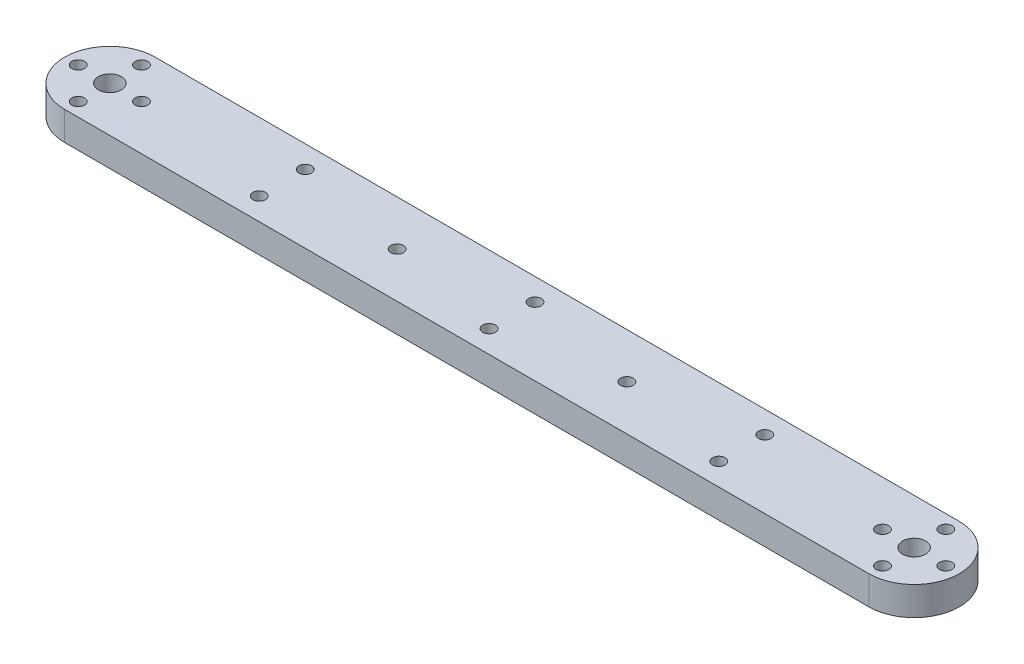
ISO-10303-21;
HEADER;
FILE_DESCRIPTION(('STEP AP214'),'2;1');
FILE_NAME('part.step','',(''),(''),'','','');
FILE_SCHEMA(('AUTOMOTIVE_DESIGN { 1 0 10303 214 1 1 1 1 }'));
ENDSEC;
DATA;
#1=APPLICATION_CONTEXT('core data for automotive mechanical design processes');
#2=APPLICATION_PROTOCOL_DEFINITION('international standard','automotive_design',2000,#1);
#3=PRODUCT_CONTEXT('',#1,'mechanical');
#4=PRODUCT('Part','Part','',(#3));
#5=PRODUCT_RELATED_PRODUCT_CATEGORY('part','',(#4));
#6=PRODUCT_DEFINITION_FORMATION('','',#4);
#7=PRODUCT_DEFINITION_CONTEXT('part definition',#1,'design');
#8=PRODUCT_DEFINITION('design','',#6,#7);
#9=PRODUCT_DEFINITION_SHAPE('','',#8);
#10=(LENGTH_UNIT() NAMED_UNIT(*) SI_UNIT(.MILLI.,.METRE.));
#11=(NAMED_UNIT(*) PLANE_ANGLE_UNIT() SI_UNIT($,.RADIAN.));
#12=(NAMED_UNIT(*) SI_UNIT($,.STERADIAN.) SOLID_ANGLE_UNIT());
#13=UNCERTAINTY_MEASURE_WITH_UNIT(LENGTH_MEASURE(1.E-05),#10,'distance_accuracy_value','');
#14=(GEOMETRIC_REPRESENTATION_CONTEXT(3) GLOBAL_UNCERTAINTY_ASSIGNED_CONTEXT((#13)) GLOBAL_UNIT_ASSIGNED_CONTEXT((#10,
#11,#12)) REPRESENTATION_CONTEXT('',''));
#15=CARTESIAN_POINT('',(0.,0.,0.));
#16=DIRECTION('',(0.,0.,1.));
#17=DIRECTION('',(1.,0.,0.));
#18=AXIS2_PLACEMENT_3D('',#15,#16,#17);
#19=CARTESIAN_POINT('',(0.,6.35,0.));
#20=DIRECTION('',(0.,1.,0.));
#21=DIRECTION('',(0.,0.,1.));
#22=AXIS2_PLACEMENT_3D('',#19,#20,#21);
#23=PLANE('',#22);
#24=CARTESIAN_POINT('',(139.7,6.35,-5.08000000000001));
#25=DIRECTION('',(0.,1.,0.));
#26=DIRECTION('',(0.,0.,1.));
#27=AXIS2_PLACEMENT_3D('',#24,#25,#26);
#28=CIRCLE('',#27,1.39699999999999);
#29=CARTESIAN_POINT('',(139.7,6.35,-3.68300000000002));
#30=VERTEX_POINT('',#29);
#31=EDGE_CURVE('E214',#30,#30,#28,.T.);
#32=ORIENTED_EDGE('',*,*,#31,.F.);
#33=EDGE_LOOP('',(#32));
#34=FACE_BOUND('',#33,.T.);
#35=CARTESIAN_POINT('',(38.1,6.35,5.08000000000001));
#36=DIRECTION('',(0.,1.,0.));
#37=DIRECTION('',(0.,0.,1.));
#38=AXIS2_PLACEMENT_3D('',#35,#36,#37);
#39=CIRCLE('',#38,1.39699999999999);
#40=CARTESIAN_POINT('',(38.1,6.35,6.477));
#41=VERTEX_POINT('',#40);
#42=EDGE_CURVE('E201',#41,#41,#39,.T.);
#43=ORIENTED_EDGE('',*,*,#42,.F.);
#44=EDGE_LOOP('',(#43));
#45=FACE_BOUND('',#44,.T.);
#46=CARTESIAN_POINT('',(63.5,6.35,0.));
#47=DIRECTION('',(0.,1.,0.));
#48=DIRECTION('',(0.,0.,1.));
#49=AXIS2_PLACEMENT_3D('',#46,#47,#48);
#50=CIRCLE('',#49,1.39699999999999);
#51=CARTESIAN_POINT('',(63.5,6.35,1.39699999999999));
#52=VERTEX_POINT('',#51);
#53=EDGE_CURVE('E191',#52,#52,#50,.T.);
#54=ORIENTED_EDGE('',*,*,#53,.F.);
#55=EDGE_LOOP('',(#54));
#56=FACE_BOUND('',#55,.T.);
#57=CARTESIAN_POINT('',(88.9,6.35,-5.08));
#58=DIRECTION('',(0.,1.,0.));
#59=DIRECTION('',(0.,0.,1.));
#60=AXIS2_PLACEMENT_3D('',#57,#58,#59);
#61=CIRCLE('',#60,1.39699999999999);
#62=CARTESIAN_POINT('',(88.9,6.35,-3.68300000000001));
#63=VERTEX_POINT('',#62);
#64=EDGE_CURVE('E178',#63,#63,#61,.T.);
#65=ORIENTED_EDGE('',*,*,#64,.F.);
#66=EDGE_LOOP('',(#65));
#67=FACE_BOUND('',#66,.T.);
#68=CARTESIAN_POINT('',(177.8,6.35,0.));
#69=DIRECTION('',(0.,1.,0.));
#70=DIRECTION('',(0.,0.,-1.));
#71=AXIS2_PLACEMENT_3D('',#68,#69,#70);
#72=CIRCLE('',#71,2.53999999999998);
#73=CARTESIAN_POINT('',(177.8,6.35,-2.53999999999998));
#74=VERTEX_POINT('',#73);
#75=EDGE_CURVE('E170',#74,#74,#72,.T.);
#76=ORIENTED_EDGE('',*,*,#75,.F.);
#77=EDGE_LOOP('',(#76));
#78=FACE_BOUND('',#77,.T.);
#79=CARTESIAN_POINT('',(184.8,6.35,0.));
#80=DIRECTION('',(0.,1.,0.));
#81=DIRECTION('',(0.,0.,-1.));
#82=AXIS2_PLACEMENT_3D('',#79,#80,#81);
#83=CIRCLE('',#82,1.39699999999997);
#84=CARTESIAN_POINT('',(184.8,6.35,-1.39699999999997));
#85=VERTEX_POINT('',#84);
#86=EDGE_CURVE('E154',#85,#85,#83,.T.);
#87=ORIENTED_EDGE('',*,*,#86,.F.);
#88=EDGE_LOOP('',(#87));
#89=FACE_BOUND('',#88,.T.);
#90=CARTESIAN_POINT('',(0.,6.35,7.));
#91=DIRECTION('',(0.,1.,0.));
#92=DIRECTION('',(0.,0.,1.));
#93=AXIS2_PLACEMENT_3D('',#90,#91,#92);
#94=CIRCLE('',#93,1.397);
#95=CARTESIAN_POINT('',(0.,6.35,8.397));
#96=VERTEX_POINT('',#95);
#97=EDGE_CURVE('E141',#96,#96,#94,.T.);
#98=ORIENTED_EDGE('',*,*,#97,.F.);
#99=EDGE_LOOP('',(#98));
#100=FACE_BOUND('',#99,.T.);
#101=CARTESIAN_POINT('',(0.,6.35,-7.));
#102=DIRECTION('',(0.,1.,0.));
#103=DIRECTION('',(0.,0.,1.));
#104=AXIS2_PLACEMENT_3D('',#101,#102,#103);
#105=CIRCLE('',#104,1.397);
#106=CARTESIAN_POINT('',(0.,6.35,-5.603));
#107=VERTEX_POINT('',#106);
#108=EDGE_CURVE('E132',#107,#107,#105,.T.);
#109=ORIENTED_EDGE('',*,*,#108,.F.);
#110=EDGE_LOOP('',(#109));
#111=FACE_BOUND('',#110,.T.);
#112=CARTESIAN_POINT('',(-7.,6.35,0.));
#113=DIRECTION('',(0.,1.,0.));
#114=DIRECTION('',(0.,0.,1.));
#115=AXIS2_PLACEMENT_3D('',#112,#113,#114);
#116=CIRCLE('',#115,1.397);
#117=CARTESIAN_POINT('',(-7.,6.35,1.397));
#118=VERTEX_POINT('',#117);
#119=EDGE_CURVE('E109',#118,#118,#116,.T.);
#120=ORIENTED_EDGE('',*,*,#119,.F.);
#121=EDGE_LOOP('',(#120));
#122=FACE_BOUND('',#121,.T.);
#123=CARTESIAN_POINT('',(0.,6.35,0.));
#124=DIRECTION('',(0.,1.,0.));
#125=DIRECTION('',(0.,0.,1.));
#126=AXIS2_PLACEMENT_3D('',#123,#124,#125);
#127=CIRCLE('',#126,10.);
#128=CARTESIAN_POINT('',(0.,6.35,-10.));
#129=VERTEX_POINT('',#128);
#130=CARTESIAN_POINT('',(0.,6.35,10.));
#131=VERTEX_POINT('',#130);
#132=EDGE_CURVE('E92',#129,#131,#127,.T.);
#133=ORIENTED_EDGE('',*,*,#132,.T.);
#134=DIRECTION('',(1.,0.,0.));
#135=VECTOR('',#134,1.);
#136=CARTESIAN_POINT('',(0.,6.35,10.));
#137=LINE('',#136,#135);
#138=CARTESIAN_POINT('',(177.8,6.35,10.));
#139=VERTEX_POINT('',#138);
#140=EDGE_CURVE('E89',#131,#139,#137,.T.);
#141=ORIENTED_EDGE('',*,*,#140,.T.);
#142=CARTESIAN_POINT('',(177.8,6.35,0.));
#143=DIRECTION('',(0.,1.,0.));
#144=DIRECTION('',(0.,0.,1.));
#145=AXIS2_PLACEMENT_3D('',#142,#143,#144);
#146=CIRCLE('',#145,10.);
#147=CARTESIAN_POINT('',(177.8,6.35,-10.));
#148=VERTEX_POINT('',#147);
#149=EDGE_CURVE('E91',#139,#148,#146,.T.);
#150=ORIENTED_EDGE('',*,*,#149,.T.);
#151=DIRECTION('',(-1.,0.,0.));
#152=VECTOR('',#151,1.);
#153=CARTESIAN_POINT('',(0.,6.35,-10.));
#154=LINE('',#153,#152);
#155=EDGE_CURVE('E58',#148,#129,#154,.T.);
#156=ORIENTED_EDGE('',*,*,#155,.T.);
#157=EDGE_LOOP('',(#133,#141,#150,#156));
#158=FACE_BOUND('',#157,.T.);
#159=CARTESIAN_POINT('',(0.,6.35,0.));
#160=DIRECTION('',(0.,1.,0.));
#161=DIRECTION('',(0.,0.,1.));
#162=AXIS2_PLACEMENT_3D('',#159,#160,#161);
#163=CIRCLE('',#162,2.54);
#164=CARTESIAN_POINT('',(0.,6.35,2.54));
#165=VERTEX_POINT('',#164);
#166=EDGE_CURVE('E125',#165,#165,#163,.T.);
#167=ORIENTED_EDGE('',*,*,#166,.F.);
#168=EDGE_LOOP('',(#167));
#169=FACE_BOUND('',#168,.T.);
#170=CARTESIAN_POINT('',(7.,6.35,0.));
#171=DIRECTION('',(0.,1.,0.));
#172=DIRECTION('',(0.,0.,1.));
#173=AXIS2_PLACEMENT_3D('',#170,#171,#172);
#174=CIRCLE('',#173,1.397);
#175=CARTESIAN_POINT('',(7.,6.35,1.397));
#176=VERTEX_POINT('',#175);
#177=EDGE_CURVE('E137',#176,#176,#174,.T.);
#178=ORIENTED_EDGE('',*,*,#177,.F.);
#179=EDGE_LOOP('',(#178));
#180=FACE_BOUND('',#179,.T.);
#181=CARTESIAN_POINT('',(177.8,6.35,-7.));
#182=DIRECTION('',(0.,1.,0.));
#183=DIRECTION('',(0.,0.,-1.));
#184=AXIS2_PLACEMENT_3D('',#181,#182,#183);
#185=CIRCLE('',#184,1.39700000000002);
#186=CARTESIAN_POINT('',(177.8,6.35,-8.39700000000002));
#187=VERTEX_POINT('',#186);
#188=EDGE_CURVE('E149',#187,#187,#185,.T.);
#189=ORIENTED_EDGE('',*,*,#188,.F.);
#190=EDGE_LOOP('',(#189));
#191=FACE_BOUND('',#190,.T.);
#192=CARTESIAN_POINT('',(177.8,6.35,7.));
#193=DIRECTION('',(0.,1.,0.));
#194=DIRECTION('',(0.,0.,-1.));
#195=AXIS2_PLACEMENT_3D('',#192,#193,#194);
#196=CIRCLE('',#195,1.39700000000002);
#197=CARTESIAN_POINT('',(177.8,6.35,5.60299999999998));
#198=VERTEX_POINT('',#197);
#199=EDGE_CURVE('E161',#198,#198,#196,.T.);
#200=ORIENTED_EDGE('',*,*,#199,.F.);
#201=EDGE_LOOP('',(#200));
#202=FACE_BOUND('',#201,.T.);
#203=CARTESIAN_POINT('',(170.8,6.35,0.));
#204=DIRECTION('',(0.,1.,0.));
#205=DIRECTION('',(0.,0.,-1.));
#206=AXIS2_PLACEMENT_3D('',#203,#204,#205);
#207=CIRCLE('',#206,1.39700000000002);
#208=CARTESIAN_POINT('',(170.8,6.35,-1.39700000000002));
#209=VERTEX_POINT('',#208);
#210=EDGE_CURVE('E174',#209,#209,#207,.T.);
#211=ORIENTED_EDGE('',*,*,#210,.F.);
#212=EDGE_LOOP('',(#211));
#213=FACE_BOUND('',#212,.T.);
#214=CARTESIAN_POINT('',(88.9,6.35,5.08));
#215=DIRECTION('',(0.,1.,0.));
#216=DIRECTION('',(0.,0.,-1.));
#217=AXIS2_PLACEMENT_3D('',#214,#215,#216);
#218=CIRCLE('',#217,1.39699999999999);
#219=CARTESIAN_POINT('',(88.9,6.35,3.68300000000001));
#220=VERTEX_POINT('',#219);
#221=EDGE_CURVE('E183',#220,#220,#218,.T.);
#222=ORIENTED_EDGE('',*,*,#221,.F.);
#223=EDGE_LOOP('',(#222));
#224=FACE_BOUND('',#223,.T.);
#225=CARTESIAN_POINT('',(38.1,6.35,-5.07999999999999));
#226=DIRECTION('',(0.,1.,0.));
#227=DIRECTION('',(0.,0.,-1.));
#228=AXIS2_PLACEMENT_3D('',#225,#226,#227);
#229=CIRCLE('',#228,1.39699999999999);
#230=CARTESIAN_POINT('',(38.1,6.35,-6.47699999999998));
#231=VERTEX_POINT('',#230);
#232=EDGE_CURVE('E197',#231,#231,#229,.T.);
#233=ORIENTED_EDGE('',*,*,#232,.F.);
#234=EDGE_LOOP('',(#233));
#235=FACE_BOUND('',#234,.T.);
#236=CARTESIAN_POINT('',(114.3,6.35,0.));
#237=DIRECTION('',(0.,1.,0.));
#238=DIRECTION('',(0.,0.,-1.));
#239=AXIS2_PLACEMENT_3D('',#236,#237,#238);
#240=CIRCLE('',#239,1.39699999999999);
#241=CARTESIAN_POINT('',(114.3,6.35,-1.39699999999999));
#242=VERTEX_POINT('',#241);
#243=EDGE_CURVE('E207',#242,#242,#240,.T.);
#244=ORIENTED_EDGE('',*,*,#243,.F.);
#245=EDGE_LOOP('',(#244));
#246=FACE_BOUND('',#245,.T.);
#247=CARTESIAN_POINT('',(139.7,6.35,5.07999999999999));
#248=DIRECTION('',(0.,1.,0.));
#249=DIRECTION('',(0.,0.,-1.));
#250=AXIS2_PLACEMENT_3D('',#247,#248,#249);
#251=CIRCLE('',#250,1.39699999999999);
#252=CARTESIAN_POINT('',(139.7,6.35,3.683));
#253=VERTEX_POINT('',#252);
#254=EDGE_CURVE('E222',#253,#253,#251,.T.);
#255=ORIENTED_EDGE('',*,*,#254,.F.);
#256=EDGE_LOOP('',(#255));
#257=FACE_BOUND('',#256,.T.);
#258=ADVANCED_FACE('F43',(#34,#45,#56,#67,#78,#89,#100,#111,#122,#158,#169,#180,#191,#202,#213,
#224,#235,#246,#257),#23,.T.);
#259=CARTESIAN_POINT('',(0.,0.,0.));
#260=DIRECTION('',(0.,1.,0.));
#261=DIRECTION('',(0.,0.,1.));
#262=AXIS2_PLACEMENT_3D('',#259,#260,#261);
#263=PLANE('',#262);
#264=CARTESIAN_POINT('',(0.,0.,0.));
#265=DIRECTION('',(0.,1.,0.));
#266=DIRECTION('',(0.,0.,1.));
#267=AXIS2_PLACEMENT_3D('',#264,#265,#266);
#268=CIRCLE('',#267,10.);
#269=CARTESIAN_POINT('',(0.,0.,-10.));
#270=VERTEX_POINT('',#269);
#271=CARTESIAN_POINT('',(0.,0.,10.));
#272=VERTEX_POINT('',#271);
#273=EDGE_CURVE('E110',#270,#272,#268,.T.);
#274=ORIENTED_EDGE('',*,*,#273,.F.);
#275=DIRECTION('',(-1.,0.,0.));
#276=VECTOR('',#275,1.);
#277=CARTESIAN_POINT('',(0.,0.,-10.));
#278=LINE('',#277,#276);
#279=CARTESIAN_POINT('',(177.8,0.,-10.));
#280=VERTEX_POINT('',#279);
#281=EDGE_CURVE('E84',#280,#270,#278,.T.);
#282=ORIENTED_EDGE('',*,*,#281,.F.);
#283=CARTESIAN_POINT('',(177.8,0.,0.));
#284=DIRECTION('',(0.,1.,0.));
#285=DIRECTION('',(0.,0.,1.));
#286=AXIS2_PLACEMENT_3D('',#283,#284,#285);
#287=CIRCLE('',#286,10.);
#288=CARTESIAN_POINT('',(177.8,0.,10.));
#289=VERTEX_POINT('',#288);
#290=EDGE_CURVE('E80',#289,#280,#287,.T.);
#291=ORIENTED_EDGE('',*,*,#290,.F.);
#292=DIRECTION('',(1.,0.,0.));
#293=VECTOR('',#292,1.);
#294=CARTESIAN_POINT('',(0.,0.,10.));
#295=LINE('',#294,#293);
#296=EDGE_CURVE('E97',#272,#289,#295,.T.);
#297=ORIENTED_EDGE('',*,*,#296,.F.);
#298=EDGE_LOOP('',(#274,#282,#291,#297));
#299=FACE_BOUND('',#298,.T.);
#300=CARTESIAN_POINT('',(-7.,0.,0.));
#301=DIRECTION('',(0.,1.,0.));
#302=DIRECTION('',(0.,0.,1.));
#303=AXIS2_PLACEMENT_3D('',#300,#301,#302);
#304=CIRCLE('',#303,1.397);
#305=CARTESIAN_POINT('',(-7.,0.,1.397));
#306=VERTEX_POINT('',#305);
#307=EDGE_CURVE('E122',#306,#306,#304,.T.);
#308=ORIENTED_EDGE('',*,*,#307,.T.);
#309=EDGE_LOOP('',(#308));
#310=FACE_BOUND('',#309,.T.);
#311=CARTESIAN_POINT('',(0.,0.,0.));
#312=DIRECTION('',(0.,1.,0.));
#313=DIRECTION('',(0.,0.,1.));
#314=AXIS2_PLACEMENT_3D('',#311,#312,#313);
#315=CIRCLE('',#314,2.54);
#316=CARTESIAN_POINT('',(0.,0.,2.54));
#317=VERTEX_POINT('',#316);
#318=EDGE_CURVE('E126',#317,#317,#315,.T.);
#319=ORIENTED_EDGE('',*,*,#318,.T.);
#320=EDGE_LOOP('',(#319));
#321=FACE_BOUND('',#320,.T.);
#322=CARTESIAN_POINT('',(0.,0.,-7.));
#323=DIRECTION('',(0.,1.,0.));
#324=DIRECTION('',(0.,0.,1.));
#325=AXIS2_PLACEMENT_3D('',#322,#323,#324);
#326=CIRCLE('',#325,1.397);
#327=CARTESIAN_POINT('',(0.,0.,-5.603));
#328=VERTEX_POINT('',#327);
#329=EDGE_CURVE('E131',#328,#328,#326,.T.);
#330=ORIENTED_EDGE('',*,*,#329,.T.);
#331=EDGE_LOOP('',(#330));
#332=FACE_BOUND('',#331,.T.);
#333=CARTESIAN_POINT('',(7.,0.,0.));
#334=DIRECTION('',(0.,1.,0.));
#335=DIRECTION('',(0.,0.,1.));
#336=AXIS2_PLACEMENT_3D('',#333,#334,#335);
#337=CIRCLE('',#336,1.397);
#338=CARTESIAN_POINT('',(7.,0.,1.397));
#339=VERTEX_POINT('',#338);
#340=EDGE_CURVE('E140',#339,#339,#337,.T.);
#341=ORIENTED_EDGE('',*,*,#340,.T.);
#342=EDGE_LOOP('',(#341));
#343=FACE_BOUND('',#342,.T.);
#344=CARTESIAN_POINT('',(0.,0.,7.));
#345=DIRECTION('',(0.,1.,0.));
#346=DIRECTION('',(0.,0.,1.));
#347=AXIS2_PLACEMENT_3D('',#344,#345,#346);
#348=CIRCLE('',#347,1.397);
#349=CARTESIAN_POINT('',(0.,0.,8.397));
#350=VERTEX_POINT('',#349);
#351=EDGE_CURVE('E148',#350,#350,#348,.T.);
#352=ORIENTED_EDGE('',*,*,#351,.T.);
#353=EDGE_LOOP('',(#352));
#354=FACE_BOUND('',#353,.T.);
#355=CARTESIAN_POINT('',(177.8,0.,-7.));
#356=DIRECTION('',(0.,1.,0.));
#357=DIRECTION('',(0.,0.,-1.));
#358=AXIS2_PLACEMENT_3D('',#355,#356,#357);
#359=CIRCLE('',#358,1.39700000000002);
#360=CARTESIAN_POINT('',(177.8,0.,-8.39700000000002));
#361=VERTEX_POINT('',#360);
#362=EDGE_CURVE('E155',#361,#361,#359,.T.);
#363=ORIENTED_EDGE('',*,*,#362,.T.);
#364=EDGE_LOOP('',(#363));
#365=FACE_BOUND('',#364,.T.);
#366=CARTESIAN_POINT('',(184.8,0.,0.));
#367=DIRECTION('',(0.,1.,0.));
#368=DIRECTION('',(0.,0.,-1.));
#369=AXIS2_PLACEMENT_3D('',#366,#367,#368);
#370=CIRCLE('',#369,1.39699999999997);
#371=CARTESIAN_POINT('',(184.8,0.,-1.39699999999997));
#372=VERTEX_POINT('',#371);
#373=EDGE_CURVE('E158',#372,#372,#370,.T.);
#374=ORIENTED_EDGE('',*,*,#373,.T.);
#375=EDGE_LOOP('',(#374));
#376=FACE_BOUND('',#375,.T.);
#377=CARTESIAN_POINT('',(177.8,0.,7.));
#378=DIRECTION('',(0.,1.,0.));
#379=DIRECTION('',(0.,0.,-1.));
#380=AXIS2_PLACEMENT_3D('',#377,#378,#379);
#381=CIRCLE('',#380,1.39700000000002);
#382=CARTESIAN_POINT('',(177.8,0.,5.60299999999998));
#383=VERTEX_POINT('',#382);
#384=EDGE_CURVE('E163',#383,#383,#381,.T.);
#385=ORIENTED_EDGE('',*,*,#384,.T.);
#386=EDGE_LOOP('',(#385));
#387=FACE_BOUND('',#386,.T.);
#388=CARTESIAN_POINT('',(177.8,0.,0.));
#389=DIRECTION('',(0.,1.,0.));
#390=DIRECTION('',(0.,0.,-1.));
#391=AXIS2_PLACEMENT_3D('',#388,#389,#390);
#392=CIRCLE('',#391,2.53999999999998);
#393=CARTESIAN_POINT('',(177.8,0.,-2.53999999999998));
#394=VERTEX_POINT('',#393);
#395=EDGE_CURVE('E168',#394,#394,#392,.T.);
#396=ORIENTED_EDGE('',*,*,#395,.T.);
#397=EDGE_LOOP('',(#396));
#398=FACE_BOUND('',#397,.T.);
#399=CARTESIAN_POINT('',(170.8,0.,0.));
#400=DIRECTION('',(0.,1.,0.));
#401=DIRECTION('',(0.,0.,-1.));
#402=AXIS2_PLACEMENT_3D('',#399,#400,#401);
#403=CIRCLE('',#402,1.39700000000002);
#404=CARTESIAN_POINT('',(170.8,0.,-1.39700000000002));
#405=VERTEX_POINT('',#404);
#406=EDGE_CURVE('E176',#405,#405,#403,.T.);
#407=ORIENTED_EDGE('',*,*,#406,.T.);
#408=EDGE_LOOP('',(#407));
#409=FACE_BOUND('',#408,.T.);
#410=CARTESIAN_POINT('',(88.9,0.,-5.08));
#411=DIRECTION('',(0.,1.,0.));
#412=DIRECTION('',(0.,0.,1.));
#413=AXIS2_PLACEMENT_3D('',#410,#411,#412);
#414=CIRCLE('',#413,1.39699999999999);
#415=CARTESIAN_POINT('',(88.9,0.,-3.68300000000001));
#416=VERTEX_POINT('',#415);
#417=EDGE_CURVE('E185',#416,#416,#414,.T.);
#418=ORIENTED_EDGE('',*,*,#417,.T.);
#419=EDGE_LOOP('',(#418));
#420=FACE_BOUND('',#419,.T.);
#421=CARTESIAN_POINT('',(88.9,0.,5.08));
#422=DIRECTION('',(0.,1.,0.));
#423=DIRECTION('',(0.,0.,-1.));
#424=AXIS2_PLACEMENT_3D('',#421,#422,#423);
#425=CIRCLE('',#424,1.39699999999999);
#426=CARTESIAN_POINT('',(88.9,0.,3.68300000000001));
#427=VERTEX_POINT('',#426);
#428=EDGE_CURVE('E189',#427,#427,#425,.T.);
#429=ORIENTED_EDGE('',*,*,#428,.T.);
#430=EDGE_LOOP('',(#429));
#431=FACE_BOUND('',#430,.T.);
#432=CARTESIAN_POINT('',(63.5,0.,0.));
#433=DIRECTION('',(0.,1.,0.));
#434=DIRECTION('',(0.,0.,1.));
#435=AXIS2_PLACEMENT_3D('',#432,#433,#434);
#436=CIRCLE('',#435,1.39699999999999);
#437=CARTESIAN_POINT('',(63.5,0.,1.39699999999999));
#438=VERTEX_POINT('',#437);
#439=EDGE_CURVE('E193',#438,#438,#436,.T.);
#440=ORIENTED_EDGE('',*,*,#439,.T.);
#441=EDGE_LOOP('',(#440));
#442=FACE_BOUND('',#441,.T.);
#443=CARTESIAN_POINT('',(38.1,0.,-5.07999999999999));
#444=DIRECTION('',(0.,1.,0.));
#445=DIRECTION('',(0.,0.,-1.));
#446=AXIS2_PLACEMENT_3D('',#443,#444,#445);
#447=CIRCLE('',#446,1.39699999999999);
#448=CARTESIAN_POINT('',(38.1,0.,-6.47699999999998));
#449=VERTEX_POINT('',#448);
#450=EDGE_CURVE('E199',#449,#449,#447,.T.);
#451=ORIENTED_EDGE('',*,*,#450,.T.);
#452=EDGE_LOOP('',(#451));
#453=FACE_BOUND('',#452,.T.);
#454=CARTESIAN_POINT('',(38.1,0.,5.08000000000001));
#455=DIRECTION('',(0.,1.,0.));
#456=DIRECTION('',(0.,0.,1.));
#457=AXIS2_PLACEMENT_3D('',#454,#455,#456);
#458=CIRCLE('',#457,1.39699999999999);
#459=CARTESIAN_POINT('',(38.1,0.,6.477));
#460=VERTEX_POINT('',#459);
#461=EDGE_CURVE('E206',#460,#460,#458,.T.);
#462=ORIENTED_EDGE('',*,*,#461,.T.);
#463=EDGE_LOOP('',(#462));
#464=FACE_BOUND('',#463,.T.);
#465=CARTESIAN_POINT('',(114.3,0.,0.));
#466=DIRECTION('',(0.,1.,0.));
#467=DIRECTION('',(0.,0.,-1.));
#468=AXIS2_PLACEMENT_3D('',#465,#466,#467);
#469=CIRCLE('',#468,1.39699999999999);
#470=CARTESIAN_POINT('',(114.3,0.,-1.39699999999999));
#471=VERTEX_POINT('',#470);
#472=EDGE_CURVE('E215',#471,#471,#469,.T.);
#473=ORIENTED_EDGE('',*,*,#472,.T.);
#474=EDGE_LOOP('',(#473));
#475=FACE_BOUND('',#474,.T.);
#476=CARTESIAN_POINT('',(139.7,0.,-5.08000000000001));
#477=DIRECTION('',(0.,1.,0.));
#478=DIRECTION('',(0.,0.,1.));
#479=AXIS2_PLACEMENT_3D('',#476,#477,#478);
#480=CIRCLE('',#479,1.39699999999999);
#481=CARTESIAN_POINT('',(139.7,0.,-3.68300000000002));
#482=VERTEX_POINT('',#481);
#483=EDGE_CURVE('E217',#482,#482,#480,.T.);
#484=ORIENTED_EDGE('',*,*,#483,.T.);
#485=EDGE_LOOP('',(#484));
#486=FACE_BOUND('',#485,.T.);
#487=CARTESIAN_POINT('',(139.7,0.,5.07999999999999));
#488=DIRECTION('',(0.,1.,0.));
#489=DIRECTION('',(0.,0.,-1.));
#490=AXIS2_PLACEMENT_3D('',#487,#488,#489);
#491=CIRCLE('',#490,1.39699999999999);
#492=CARTESIAN_POINT('',(139.7,0.,3.683));
#493=VERTEX_POINT('',#492);
#494=EDGE_CURVE('E221',#493,#493,#491,.T.);
#495=ORIENTED_EDGE('',*,*,#494,.T.);
#496=EDGE_LOOP('',(#495));
#497=FACE_BOUND('',#496,.T.);
#498=ADVANCED_FACE('F119',(#299,#310,#321,#332,#343,#354,#365,#376,#387,#398,#409,#420,#431,
#442,#453,#464,#475,#486,#497),#263,.F.);
#499=CARTESIAN_POINT('',(0.,6.35,0.));
#500=DIRECTION('',(0.,-1.,0.));
#501=DIRECTION('',(0.,0.,-1.));
#502=AXIS2_PLACEMENT_3D('',#499,#500,#501);
#503=CYLINDRICAL_SURFACE('',#502,10.);
#504=ORIENTED_EDGE('',*,*,#273,.T.);
#505=DIRECTION('',(0.,-1.,0.));
#506=VECTOR('',#505,1.);
#507=CARTESIAN_POINT('',(0.,6.35,10.));
#508=LINE('',#507,#506);
#509=EDGE_CURVE('E11',#131,#272,#508,.T.);
#510=ORIENTED_EDGE('',*,*,#509,.F.);
#511=ORIENTED_EDGE('',*,*,#132,.F.);
#512=DIRECTION('',(0.,-1.,0.));
#513=VECTOR('',#512,1.);
#514=CARTESIAN_POINT('',(0.,6.35,-10.));
#515=LINE('',#514,#513);
#516=EDGE_CURVE('E103',#129,#270,#515,.T.);
#517=ORIENTED_EDGE('',*,*,#516,.T.);
#518=EDGE_LOOP('',(#504,#510,#511,#517));
#519=FACE_BOUND('',#518,.T.);
#520=ADVANCED_FACE('F44',(#519),#503,.T.);
#521=CARTESIAN_POINT('',(0.,6.35,10.));
#522=DIRECTION('',(0.,0.,-1.));
#523=DIRECTION('',(-1.,0.,0.));
#524=AXIS2_PLACEMENT_3D('',#521,#522,#523);
#525=PLANE('',#524);
#526=ORIENTED_EDGE('',*,*,#296,.T.);
#527=DIRECTION('',(0.,-1.,0.));
#528=VECTOR('',#527,1.);
#529=CARTESIAN_POINT('',(177.8,6.35,10.));
#530=LINE('',#529,#528);
#531=EDGE_CURVE('E55',#139,#289,#530,.T.);
#532=ORIENTED_EDGE('',*,*,#531,.F.);
#533=ORIENTED_EDGE('',*,*,#140,.F.);
#534=ORIENTED_EDGE('',*,*,#509,.T.);
#535=EDGE_LOOP('',(#526,#532,#533,#534));
#536=FACE_BOUND('',#535,.T.);
#537=ADVANCED_FACE('F98',(#536),#525,.F.);
#538=CARTESIAN_POINT('',(177.8,6.35,0.));
#539=DIRECTION('',(0.,-1.,0.));
#540=DIRECTION('',(0.,0.,-1.));
#541=AXIS2_PLACEMENT_3D('',#538,#539,#540);
#542=CYLINDRICAL_SURFACE('',#541,10.);
#543=ORIENTED_EDGE('',*,*,#290,.T.);
#544=DIRECTION('',(0.,-1.,0.));
#545=VECTOR('',#544,1.);
#546=CARTESIAN_POINT('',(177.8,6.35,-10.));
#547=LINE('',#546,#545);
#548=EDGE_CURVE('E99',#148,#280,#547,.T.);
#549=ORIENTED_EDGE('',*,*,#548,.F.);
#550=ORIENTED_EDGE('',*,*,#149,.F.);
#551=ORIENTED_EDGE('',*,*,#531,.T.);
#552=EDGE_LOOP('',(#543,#549,#550,#551));
#553=FACE_BOUND('',#552,.T.);
#554=ADVANCED_FACE('F101',(#553),#542,.T.);
#555=CARTESIAN_POINT('',(0.,6.35,-10.));
#556=DIRECTION('',(0.,0.,1.));
#557=DIRECTION('',(1.,0.,0.));
#558=AXIS2_PLACEMENT_3D('',#555,#556,#557);
#559=PLANE('',#558);
#560=ORIENTED_EDGE('',*,*,#281,.T.);
#561=ORIENTED_EDGE('',*,*,#516,.F.);
#562=ORIENTED_EDGE('',*,*,#155,.F.);
#563=ORIENTED_EDGE('',*,*,#548,.T.);
#564=EDGE_LOOP('',(#560,#561,#562,#563));
#565=FACE_BOUND('',#564,.T.);
#566=ADVANCED_FACE('F113',(#565),#559,.F.);
#567=CARTESIAN_POINT('',(-7.,6.35,0.));
#568=DIRECTION('',(0.,-1.,0.));
#569=DIRECTION('',(0.,0.,-1.));
#570=AXIS2_PLACEMENT_3D('',#567,#568,#569);
#571=CYLINDRICAL_SURFACE('',#570,1.397);
#572=ORIENTED_EDGE('',*,*,#119,.T.);
#573=EDGE_LOOP('',(#572));
#574=FACE_BOUND('',#573,.T.);
#575=ORIENTED_EDGE('',*,*,#307,.F.);
#576=EDGE_LOOP('',(#575));
#577=FACE_BOUND('',#576,.T.);
#578=ADVANCED_FACE('F244',(#574,#577),#571,.F.);
#579=CARTESIAN_POINT('',(0.,6.35,0.));
#580=DIRECTION('',(0.,-1.,0.));
#581=DIRECTION('',(0.,0.,-1.));
#582=AXIS2_PLACEMENT_3D('',#579,#580,#581);
#583=CYLINDRICAL_SURFACE('',#582,2.54);
#584=ORIENTED_EDGE('',*,*,#166,.T.);
#585=EDGE_LOOP('',(#584));
#586=FACE_BOUND('',#585,.T.);
#587=ORIENTED_EDGE('',*,*,#318,.F.);
#588=EDGE_LOOP('',(#587));
#589=FACE_BOUND('',#588,.T.);
#590=ADVANCED_FACE('F289',(#586,#589),#583,.F.);
#591=CARTESIAN_POINT('',(0.,6.35,-7.));
#592=DIRECTION('',(0.,-1.,0.));
#593=DIRECTION('',(0.,0.,-1.));
#594=AXIS2_PLACEMENT_3D('',#591,#592,#593);
#595=CYLINDRICAL_SURFACE('',#594,1.397);
#596=ORIENTED_EDGE('',*,*,#108,.T.);
#597=EDGE_LOOP('',(#596));
#598=FACE_BOUND('',#597,.T.);
#599=ORIENTED_EDGE('',*,*,#329,.F.);
#600=EDGE_LOOP('',(#599));
#601=FACE_BOUND('',#600,.T.);
#602=ADVANCED_FACE('F297',(#598,#601),#595,.F.);
#603=CARTESIAN_POINT('',(7.,6.35,0.));
#604=DIRECTION('',(0.,-1.,0.));
#605=DIRECTION('',(0.,0.,-1.));
#606=AXIS2_PLACEMENT_3D('',#603,#604,#605);
#607=CYLINDRICAL_SURFACE('',#606,1.397);
#608=ORIENTED_EDGE('',*,*,#177,.T.);
#609=EDGE_LOOP('',(#608));
#610=FACE_BOUND('',#609,.T.);
#611=ORIENTED_EDGE('',*,*,#340,.F.);
#612=EDGE_LOOP('',(#611));
#613=FACE_BOUND('',#612,.T.);
#614=ADVANCED_FACE('F303',(#610,#613),#607,.F.);
#615=CARTESIAN_POINT('',(0.,6.35,7.));
#616=DIRECTION('',(0.,-1.,0.));
#617=DIRECTION('',(0.,0.,-1.));
#618=AXIS2_PLACEMENT_3D('',#615,#616,#617);
#619=CYLINDRICAL_SURFACE('',#618,1.397);
#620=ORIENTED_EDGE('',*,*,#97,.T.);
#621=EDGE_LOOP('',(#620));
#622=FACE_BOUND('',#621,.T.);
#623=ORIENTED_EDGE('',*,*,#351,.F.);
#624=EDGE_LOOP('',(#623));
#625=FACE_BOUND('',#624,.T.);
#626=ADVANCED_FACE('F311',(#622,#625),#619,.F.);
#627=CARTESIAN_POINT('',(177.8,6.35,-7.));
#628=DIRECTION('',(0.,-1.,0.));
#629=DIRECTION('',(0.,0.,-1.));
#630=AXIS2_PLACEMENT_3D('',#627,#628,#629);
#631=CYLINDRICAL_SURFACE('',#630,1.39700000000002);
#632=ORIENTED_EDGE('',*,*,#188,.T.);
#633=EDGE_LOOP('',(#632));
#634=FACE_BOUND('',#633,.T.);
#635=ORIENTED_EDGE('',*,*,#362,.F.);
#636=EDGE_LOOP('',(#635));
#637=FACE_BOUND('',#636,.T.);
#638=ADVANCED_FACE('F325',(#634,#637),#631,.F.);
#639=CARTESIAN_POINT('',(184.8,6.35,0.));
#640=DIRECTION('',(0.,-1.,0.));
#641=DIRECTION('',(0.,0.,-1.));
#642=AXIS2_PLACEMENT_3D('',#639,#640,#641);
#643=CYLINDRICAL_SURFACE('',#642,1.39699999999997);
#644=ORIENTED_EDGE('',*,*,#86,.T.);
#645=EDGE_LOOP('',(#644));
#646=FACE_BOUND('',#645,.T.);
#647=ORIENTED_EDGE('',*,*,#373,.F.);
#648=EDGE_LOOP('',(#647));
#649=FACE_BOUND('',#648,.T.);
#650=ADVANCED_FACE('F332',(#646,#649),#643,.F.);
#651=CARTESIAN_POINT('',(177.8,6.35,7.));
#652=DIRECTION('',(0.,-1.,0.));
#653=DIRECTION('',(0.,0.,-1.));
#654=AXIS2_PLACEMENT_3D('',#651,#652,#653);
#655=CYLINDRICAL_SURFACE('',#654,1.39700000000002);
#656=ORIENTED_EDGE('',*,*,#199,.T.);
#657=EDGE_LOOP('',(#656));
#658=FACE_BOUND('',#657,.T.);
#659=ORIENTED_EDGE('',*,*,#384,.F.);
#660=EDGE_LOOP('',(#659));
#661=FACE_BOUND('',#660,.T.);
#662=ADVANCED_FACE('F338',(#658,#661),#655,.F.);
#663=CARTESIAN_POINT('',(177.8,6.35,0.));
#664=DIRECTION('',(0.,-1.,0.));
#665=DIRECTION('',(0.,0.,-1.));
#666=AXIS2_PLACEMENT_3D('',#663,#664,#665);
#667=CYLINDRICAL_SURFACE('',#666,2.53999999999998);
#668=ORIENTED_EDGE('',*,*,#75,.T.);
#669=EDGE_LOOP('',(#668));
#670=FACE_BOUND('',#669,.T.);
#671=ORIENTED_EDGE('',*,*,#395,.F.);
#672=EDGE_LOOP('',(#671));
#673=FACE_BOUND('',#672,.T.);
#674=ADVANCED_FACE('F349',(#670,#673),#667,.F.);
#675=CARTESIAN_POINT('',(170.8,6.35,0.));
#676=DIRECTION('',(0.,-1.,0.));
#677=DIRECTION('',(0.,0.,-1.));
#678=AXIS2_PLACEMENT_3D('',#675,#676,#677);
#679=CYLINDRICAL_SURFACE('',#678,1.39700000000002);
#680=ORIENTED_EDGE('',*,*,#210,.T.);
#681=EDGE_LOOP('',(#680));
#682=FACE_BOUND('',#681,.T.);
#683=ORIENTED_EDGE('',*,*,#406,.F.);
#684=EDGE_LOOP('',(#683));
#685=FACE_BOUND('',#684,.T.);
#686=ADVANCED_FACE('F359',(#682,#685),#679,.F.);
#687=CARTESIAN_POINT('',(88.9,6.35,-5.08));
#688=DIRECTION('',(0.,-1.,0.));
#689=DIRECTION('',(0.,0.,-1.));
#690=AXIS2_PLACEMENT_3D('',#687,#688,#689);
#691=CYLINDRICAL_SURFACE('',#690,1.39699999999999);
#692=ORIENTED_EDGE('',*,*,#64,.T.);
#693=EDGE_LOOP('',(#692));
#694=FACE_BOUND('',#693,.T.);
#695=ORIENTED_EDGE('',*,*,#417,.F.);
#696=EDGE_LOOP('',(#695));
#697=FACE_BOUND('',#696,.T.);
#698=ADVANCED_FACE('F370',(#694,#697),#691,.F.);
#699=CARTESIAN_POINT('',(88.9,6.35,5.08));
#700=DIRECTION('',(0.,-1.,0.));
#701=DIRECTION('',(0.,0.,-1.));
#702=AXIS2_PLACEMENT_3D('',#699,#700,#701);
#703=CYLINDRICAL_SURFACE('',#702,1.39699999999999);
#704=ORIENTED_EDGE('',*,*,#221,.T.);
#705=EDGE_LOOP('',(#704));
#706=FACE_BOUND('',#705,.T.);
#707=ORIENTED_EDGE('',*,*,#428,.F.);
#708=EDGE_LOOP('',(#707));
#709=FACE_BOUND('',#708,.T.);
#710=ADVANCED_FACE('F376',(#706,#709),#703,.F.);
#711=CARTESIAN_POINT('',(63.5,6.35,0.));
#712=DIRECTION('',(0.,-1.,0.));
#713=DIRECTION('',(0.,0.,-1.));
#714=AXIS2_PLACEMENT_3D('',#711,#712,#713);
#715=CYLINDRICAL_SURFACE('',#714,1.39699999999999);
#716=ORIENTED_EDGE('',*,*,#53,.T.);
#717=EDGE_LOOP('',(#716));
#718=FACE_BOUND('',#717,.T.);
#719=ORIENTED_EDGE('',*,*,#439,.F.);
#720=EDGE_LOOP('',(#719));
#721=FACE_BOUND('',#720,.T.);
#722=ADVANCED_FACE('F384',(#718,#721),#715,.F.);
#723=CARTESIAN_POINT('',(38.1,6.35,-5.07999999999999));
#724=DIRECTION('',(0.,-1.,0.));
#725=DIRECTION('',(0.,0.,-1.));
#726=AXIS2_PLACEMENT_3D('',#723,#724,#725);
#727=CYLINDRICAL_SURFACE('',#726,1.39699999999999);
#728=ORIENTED_EDGE('',*,*,#232,.T.);
#729=EDGE_LOOP('',(#728));
#730=FACE_BOUND('',#729,.T.);
#731=ORIENTED_EDGE('',*,*,#450,.F.);
#732=EDGE_LOOP('',(#731));
#733=FACE_BOUND('',#732,.T.);
#734=ADVANCED_FACE('F391',(#730,#733),#727,.F.);
#735=CARTESIAN_POINT('',(38.1,6.35,5.08000000000001));
#736=DIRECTION('',(0.,-1.,0.));
#737=DIRECTION('',(0.,0.,-1.));
#738=AXIS2_PLACEMENT_3D('',#735,#736,#737);
#739=CYLINDRICAL_SURFACE('',#738,1.39699999999999);
#740=ORIENTED_EDGE('',*,*,#42,.T.);
#741=EDGE_LOOP('',(#740));
#742=FACE_BOUND('',#741,.T.);
#743=ORIENTED_EDGE('',*,*,#461,.F.);
#744=EDGE_LOOP('',(#743));
#745=FACE_BOUND('',#744,.T.);
#746=ADVANCED_FACE('F401',(#742,#745),#739,.F.);
#747=CARTESIAN_POINT('',(114.3,6.35,0.));
#748=DIRECTION('',(0.,-1.,0.));
#749=DIRECTION('',(0.,0.,-1.));
#750=AXIS2_PLACEMENT_3D('',#747,#748,#749);
#751=CYLINDRICAL_SURFACE('',#750,1.39699999999999);
#752=ORIENTED_EDGE('',*,*,#243,.T.);
#753=EDGE_LOOP('',(#752));
#754=FACE_BOUND('',#753,.T.);
#755=ORIENTED_EDGE('',*,*,#472,.F.);
#756=EDGE_LOOP('',(#755));
#757=FACE_BOUND('',#756,.T.);
#758=ADVANCED_FACE('F412',(#754,#757),#751,.F.);
#759=CARTESIAN_POINT('',(139.7,6.35,-5.08000000000001));
#760=DIRECTION('',(0.,-1.,0.));
#761=DIRECTION('',(0.,0.,-1.));
#762=AXIS2_PLACEMENT_3D('',#759,#760,#761);
#763=CYLINDRICAL_SURFACE('',#762,1.39699999999999);
#764=ORIENTED_EDGE('',*,*,#31,.T.);
#765=EDGE_LOOP('',(#764));
#766=FACE_BOUND('',#765,.T.);
#767=ORIENTED_EDGE('',*,*,#483,.F.);
#768=EDGE_LOOP('',(#767));
#769=FACE_BOUND('',#768,.T.);
#770=ADVANCED_FACE('F423',(#766,#769),#763,.F.);
#771=CARTESIAN_POINT('',(139.7,6.35,5.07999999999999));
#772=DIRECTION('',(0.,-1.,0.));
#773=DIRECTION('',(0.,0.,-1.));
#774=AXIS2_PLACEMENT_3D('',#771,#772,#773);
#775=CYLINDRICAL_SURFACE('',#774,1.39699999999999);
#776=ORIENTED_EDGE('',*,*,#254,.T.);
#777=EDGE_LOOP('',(#776));
#778=FACE_BOUND('',#777,.T.);
#779=ORIENTED_EDGE('',*,*,#494,.F.);
#780=EDGE_LOOP('',(#779));
#781=FACE_BOUND('',#780,.T.);
#782=ADVANCED_FACE('F228',(#778,#781),#775,.F.);
#783=CLOSED_SHELL('',(#258,#498,#520,#537,#554,#566,#578,#590,#602,#614,#626,#638,#650,#662,
#674,#686,#698,#710,#722,#734,#746,#758,#770,#782));
#784=MANIFOLD_SOLID_BREP('B2',#783);
#785=ADVANCED_BREP_SHAPE_REPRESENTATION('',(#18,#784),#14);
#786=SHAPE_DEFINITION_REPRESENTATION(#9,#785);
ENDSEC;
END-ISO-10303-21;
